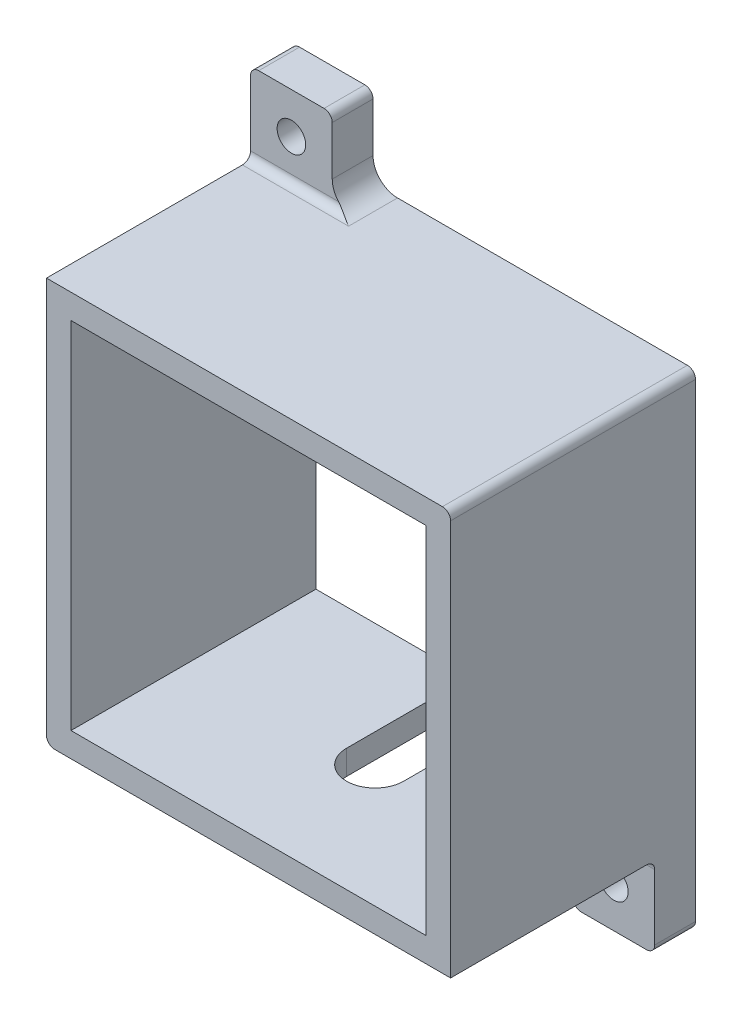
ISO-10303-21;
HEADER;
FILE_DESCRIPTION(('STEP AP214'),'2;1');
FILE_NAME('part.step','',(''),(''),'','','');
FILE_SCHEMA(('AUTOMOTIVE_DESIGN { 1 0 10303 214 1 1 1 1 }'));
ENDSEC;
DATA;
#1=APPLICATION_CONTEXT('core data for automotive mechanical design processes');
#2=APPLICATION_PROTOCOL_DEFINITION('international standard','automotive_design',2000,#1);
#3=PRODUCT_CONTEXT('',#1,'mechanical');
#4=PRODUCT('Part','Part','',(#3));
#5=PRODUCT_RELATED_PRODUCT_CATEGORY('part','',(#4));
#6=PRODUCT_DEFINITION_FORMATION('','',#4);
#7=PRODUCT_DEFINITION_CONTEXT('part definition',#1,'design');
#8=PRODUCT_DEFINITION('design','',#6,#7);
#9=PRODUCT_DEFINITION_SHAPE('','',#8);
#10=(LENGTH_UNIT() NAMED_UNIT(*) SI_UNIT(.MILLI.,.METRE.));
#11=(NAMED_UNIT(*) PLANE_ANGLE_UNIT() SI_UNIT($,.RADIAN.));
#12=(NAMED_UNIT(*) SI_UNIT($,.STERADIAN.) SOLID_ANGLE_UNIT());
#13=UNCERTAINTY_MEASURE_WITH_UNIT(LENGTH_MEASURE(1.E-05),#10,'distance_accuracy_value','');
#14=(GEOMETRIC_REPRESENTATION_CONTEXT(3) GLOBAL_UNCERTAINTY_ASSIGNED_CONTEXT((#13)) GLOBAL_UNIT_ASSIGNED_CONTEXT((#10,
#11,#12)) REPRESENTATION_CONTEXT('',''));
#15=CARTESIAN_POINT('',(0.,0.,0.));
#16=DIRECTION('',(0.,0.,1.));
#17=DIRECTION('',(1.,0.,0.));
#18=AXIS2_PLACEMENT_3D('',#15,#16,#17);
#19=CARTESIAN_POINT('',(0.,0.,30.));
#20=DIRECTION('',(0.,1.,0.));
#21=DIRECTION('',(0.,0.,1.));
#22=AXIS2_PLACEMENT_3D('',#19,#20,#21);
#23=PLANE('',#22);
#24=DIRECTION('',(1.,0.,0.));
#25=VECTOR('',#24,1.);
#26=CARTESIAN_POINT('',(0.,0.,0.));
#27=LINE('',#26,#25);
#28=CARTESIAN_POINT('',(1.,0.,0.));
#29=VERTEX_POINT('',#28);
#30=CARTESIAN_POINT('',(21.75,0.,0.));
#31=VERTEX_POINT('',#30);
#32=EDGE_CURVE('E258',#29,#31,#27,.T.);
#33=ORIENTED_EDGE('',*,*,#32,.T.);
#34=DIRECTION('',(0.,0.,1.));
#35=VECTOR('',#34,1.);
#36=CARTESIAN_POINT('',(21.75,0.,30.));
#37=LINE('',#36,#35);
#38=CARTESIAN_POINT('',(21.75,0.,15.));
#39=VERTEX_POINT('',#38);
#40=EDGE_CURVE('E248',#31,#39,#37,.T.);
#41=ORIENTED_EDGE('',*,*,#40,.T.);
#42=CARTESIAN_POINT('',(25.25,0.,15.));
#43=DIRECTION('',(0.,1.,0.));
#44=DIRECTION('',(0.,0.,1.));
#45=AXIS2_PLACEMENT_3D('',#42,#43,#44);
#46=CIRCLE('',#45,3.5);
#47=CARTESIAN_POINT('',(28.75,0.,15.));
#48=VERTEX_POINT('',#47);
#49=EDGE_CURVE('E246',#48,#39,#46,.F.);
#50=ORIENTED_EDGE('',*,*,#49,.F.);
#51=DIRECTION('',(0.,0.,1.));
#52=VECTOR('',#51,1.);
#53=CARTESIAN_POINT('',(28.75,0.,30.));
#54=LINE('',#53,#52);
#55=CARTESIAN_POINT('',(28.75,0.,0.));
#56=VERTEX_POINT('',#55);
#57=EDGE_CURVE('E231',#56,#48,#54,.T.);
#58=ORIENTED_EDGE('',*,*,#57,.F.);
#59=CARTESIAN_POINT('',(36.5,0.,0.));
#60=VERTEX_POINT('',#59);
#61=EDGE_CURVE('E243',#56,#60,#27,.T.);
#62=ORIENTED_EDGE('',*,*,#61,.T.);
#63=DIRECTION('',(0.,0.,-1.));
#64=VECTOR('',#63,1.);
#65=CARTESIAN_POINT('',(36.5,0.,30.));
#66=LINE('',#65,#64);
#67=CARTESIAN_POINT('',(36.5,0.,6.));
#68=VERTEX_POINT('',#67);
#69=EDGE_CURVE('E370',#60,#68,#66,.F.);
#70=ORIENTED_EDGE('',*,*,#69,.T.);
#71=DIRECTION('',(1.,0.,0.));
#72=VECTOR('',#71,1.);
#73=CARTESIAN_POINT('',(49.5,0.,6.));
#74=LINE('',#73,#72);
#75=CARTESIAN_POINT('',(49.5,0.,6.));
#76=VERTEX_POINT('',#75);
#77=EDGE_CURVE('E391',#68,#76,#74,.T.);
#78=ORIENTED_EDGE('',*,*,#77,.T.);
#79=DIRECTION('',(0.,0.,-1.));
#80=VECTOR('',#79,1.);
#81=CARTESIAN_POINT('',(49.5,0.,30.));
#82=LINE('',#81,#80);
#83=CARTESIAN_POINT('',(49.5,0.,30.));
#84=VERTEX_POINT('',#83);
#85=EDGE_CURVE('E281',#84,#76,#82,.T.);
#86=ORIENTED_EDGE('',*,*,#85,.F.);
#87=DIRECTION('',(1.,0.,0.));
#88=VECTOR('',#87,1.);
#89=CARTESIAN_POINT('',(0.,0.,30.));
#90=LINE('',#89,#88);
#91=CARTESIAN_POINT('',(1.,0.,30.));
#92=VERTEX_POINT('',#91);
#93=EDGE_CURVE('E558',#92,#84,#90,.T.);
#94=ORIENTED_EDGE('',*,*,#93,.F.);
#95=DIRECTION('',(0.,0.,-1.));
#96=VECTOR('',#95,1.);
#97=CARTESIAN_POINT('',(1.,0.,30.));
#98=LINE('',#97,#96);
#99=EDGE_CURVE('E328',#92,#29,#98,.T.);
#100=ORIENTED_EDGE('',*,*,#99,.T.);
#101=EDGE_LOOP('',(#33,#41,#50,#58,#62,#70,#78,#86,#94,#100));
#102=FACE_BOUND('',#101,.T.);
#103=ADVANCED_FACE('F43',(#102),#23,.F.);
#104=CARTESIAN_POINT('',(0.,49.5,30.));
#105=DIRECTION('',(0.,-1.,0.));
#106=DIRECTION('',(0.,0.,-1.));
#107=AXIS2_PLACEMENT_3D('',#104,#105,#106);
#108=PLANE('',#107);
#109=DIRECTION('',(0.,0.,-1.));
#110=VECTOR('',#109,1.);
#111=CARTESIAN_POINT('',(13.,49.5,30.));
#112=LINE('',#111,#110);
#113=CARTESIAN_POINT('',(13.,49.5,0.));
#114=VERTEX_POINT('',#113);
#115=CARTESIAN_POINT('',(13.,49.5,6.));
#116=VERTEX_POINT('',#115);
#117=EDGE_CURVE('E377',#114,#116,#112,.F.);
#118=ORIENTED_EDGE('',*,*,#117,.T.);
#119=DIRECTION('',(-1.,0.,0.));
#120=VECTOR('',#119,1.);
#121=CARTESIAN_POINT('',(0.,49.5,6.));
#122=LINE('',#121,#120);
#123=CARTESIAN_POINT('',(0.,49.5,6.));
#124=VERTEX_POINT('',#123);
#125=EDGE_CURVE('E398',#116,#124,#122,.T.);
#126=ORIENTED_EDGE('',*,*,#125,.T.);
#127=DIRECTION('',(0.,0.,-1.));
#128=VECTOR('',#127,1.);
#129=CARTESIAN_POINT('',(0.,49.5,30.));
#130=LINE('',#129,#128);
#131=CARTESIAN_POINT('',(0.,49.5,30.));
#132=VERTEX_POINT('',#131);
#133=EDGE_CURVE('E277',#132,#124,#130,.T.);
#134=ORIENTED_EDGE('',*,*,#133,.F.);
#135=DIRECTION('',(-1.,0.,0.));
#136=VECTOR('',#135,1.);
#137=CARTESIAN_POINT('',(0.,49.5,30.));
#138=LINE('',#137,#136);
#139=CARTESIAN_POINT('',(48.5,49.5,30.));
#140=VERTEX_POINT('',#139);
#141=EDGE_CURVE('E282',#140,#132,#138,.T.);
#142=ORIENTED_EDGE('',*,*,#141,.F.);
#143=DIRECTION('',(0.,0.,-1.));
#144=VECTOR('',#143,1.);
#145=CARTESIAN_POINT('',(48.5,49.5,30.));
#146=LINE('',#145,#144);
#147=CARTESIAN_POINT('',(48.5,49.5,0.));
#148=VERTEX_POINT('',#147);
#149=EDGE_CURVE('E345',#140,#148,#146,.T.);
#150=ORIENTED_EDGE('',*,*,#149,.T.);
#151=DIRECTION('',(-1.,0.,0.));
#152=VECTOR('',#151,1.);
#153=CARTESIAN_POINT('',(0.,49.5,0.));
#154=LINE('',#153,#152);
#155=EDGE_CURVE('E272',#148,#114,#154,.T.);
#156=ORIENTED_EDGE('',*,*,#155,.T.);
#157=EDGE_LOOP('',(#118,#126,#134,#142,#150,#156));
#158=FACE_BOUND('',#157,.T.);
#159=ADVANCED_FACE('F575',(#158),#108,.F.);
#160=CARTESIAN_POINT('',(0.,0.,30.));
#161=DIRECTION('',(0.,0.,-1.));
#162=DIRECTION('',(-1.,0.,0.));
#163=AXIS2_PLACEMENT_3D('',#160,#161,#162);
#164=PLANE('',#163);
#165=DIRECTION('',(0.,-1.,0.));
#166=VECTOR('',#165,1.);
#167=CARTESIAN_POINT('',(0.,0.,30.));
#168=LINE('',#167,#166);
#169=CARTESIAN_POINT('',(0.,1.,30.));
#170=VERTEX_POINT('',#169);
#171=EDGE_CURVE('E276',#132,#170,#168,.T.);
#172=ORIENTED_EDGE('',*,*,#171,.T.);
#173=CARTESIAN_POINT('',(1.,1.,30.));
#174=DIRECTION('',(0.,0.,-1.));
#175=DIRECTION('',(-1.,0.,0.));
#176=AXIS2_PLACEMENT_3D('',#173,#174,#175);
#177=CIRCLE('',#176,1.);
#178=EDGE_CURVE('E342',#170,#92,#177,.F.);
#179=ORIENTED_EDGE('',*,*,#178,.T.);
#180=ORIENTED_EDGE('',*,*,#93,.T.);
#181=DIRECTION('',(0.,1.,0.));
#182=VECTOR('',#181,1.);
#183=CARTESIAN_POINT('',(49.5,0.,30.));
#184=LINE('',#183,#182);
#185=CARTESIAN_POINT('',(49.5,48.5,30.));
#186=VERTEX_POINT('',#185);
#187=EDGE_CURVE('E561',#84,#186,#184,.T.);
#188=ORIENTED_EDGE('',*,*,#187,.T.);
#189=CARTESIAN_POINT('',(48.5,48.5,30.));
#190=DIRECTION('',(0.,0.,-1.));
#191=DIRECTION('',(-1.,0.,0.));
#192=AXIS2_PLACEMENT_3D('',#189,#190,#191);
#193=CIRCLE('',#192,1.);
#194=EDGE_CURVE('E339',#186,#140,#193,.F.);
#195=ORIENTED_EDGE('',*,*,#194,.T.);
#196=ORIENTED_EDGE('',*,*,#141,.T.);
#197=EDGE_LOOP('',(#172,#179,#180,#188,#195,#196));
#198=FACE_BOUND('',#197,.T.);
#199=DIRECTION('',(0.,-1.,0.));
#200=VECTOR('',#199,1.);
#201=CARTESIAN_POINT('',(3.,3.,30.));
#202=LINE('',#201,#200);
#203=CARTESIAN_POINT('',(3.,46.5,30.));
#204=VERTEX_POINT('',#203);
#205=CARTESIAN_POINT('',(3.,3.,30.));
#206=VERTEX_POINT('',#205);
#207=EDGE_CURVE('E513',#204,#206,#202,.T.);
#208=ORIENTED_EDGE('',*,*,#207,.F.);
#209=DIRECTION('',(-1.,0.,0.));
#210=VECTOR('',#209,1.);
#211=CARTESIAN_POINT('',(3.,46.5,30.));
#212=LINE('',#211,#210);
#213=CARTESIAN_POINT('',(46.5,46.5,30.));
#214=VERTEX_POINT('',#213);
#215=EDGE_CURVE('E524',#214,#204,#212,.T.);
#216=ORIENTED_EDGE('',*,*,#215,.F.);
#217=DIRECTION('',(0.,1.,0.));
#218=VECTOR('',#217,1.);
#219=CARTESIAN_POINT('',(46.5,3.,30.));
#220=LINE('',#219,#218);
#221=CARTESIAN_POINT('',(46.5,3.,30.));
#222=VERTEX_POINT('',#221);
#223=EDGE_CURVE('E520',#222,#214,#220,.T.);
#224=ORIENTED_EDGE('',*,*,#223,.F.);
#225=DIRECTION('',(1.,0.,0.));
#226=VECTOR('',#225,1.);
#227=CARTESIAN_POINT('',(3.,3.,30.));
#228=LINE('',#227,#226);
#229=EDGE_CURVE('E516',#206,#222,#228,.T.);
#230=ORIENTED_EDGE('',*,*,#229,.F.);
#231=EDGE_LOOP('',(#208,#216,#224,#230));
#232=FACE_BOUND('',#231,.T.);
#233=ADVANCED_FACE('F568',(#198,#232),#164,.F.);
#234=CARTESIAN_POINT('',(0.,0.,0.));
#235=DIRECTION('',(0.,0.,-1.));
#236=DIRECTION('',(-1.,0.,0.));
#237=AXIS2_PLACEMENT_3D('',#234,#235,#236);
#238=PLANE('',#237);
#239=DIRECTION('',(0.,1.,0.));
#240=VECTOR('',#239,1.);
#241=CARTESIAN_POINT('',(21.75,-24.,0.));
#242=LINE('',#241,#240);
#243=CARTESIAN_POINT('',(21.75,3.,0.));
#244=VERTEX_POINT('',#243);
#245=EDGE_CURVE('E238',#31,#244,#242,.T.);
#246=ORIENTED_EDGE('',*,*,#245,.F.);
#247=ORIENTED_EDGE('',*,*,#32,.F.);
#248=CARTESIAN_POINT('',(1.,1.,0.));
#249=DIRECTION('',(0.,0.,-1.));
#250=DIRECTION('',(-1.,0.,0.));
#251=AXIS2_PLACEMENT_3D('',#248,#249,#250);
#252=CIRCLE('',#251,1.);
#253=CARTESIAN_POINT('',(0.,1.,0.));
#254=VERTEX_POINT('',#253);
#255=EDGE_CURVE('E302',#29,#254,#252,.T.);
#256=ORIENTED_EDGE('',*,*,#255,.T.);
#257=DIRECTION('',(0.,-1.,0.));
#258=VECTOR('',#257,1.);
#259=CARTESIAN_POINT('',(0.,0.,0.));
#260=LINE('',#259,#258);
#261=CARTESIAN_POINT('',(0.,58.5,0.));
#262=VERTEX_POINT('',#261);
#263=EDGE_CURVE('E259',#262,#254,#260,.T.);
#264=ORIENTED_EDGE('',*,*,#263,.F.);
#265=CARTESIAN_POINT('',(1.,58.5,0.));
#266=DIRECTION('',(0.,0.,-1.));
#267=DIRECTION('',(-1.,0.,0.));
#268=AXIS2_PLACEMENT_3D('',#265,#266,#267);
#269=CIRCLE('',#268,1.);
#270=CARTESIAN_POINT('',(1.,59.5,0.));
#271=VERTEX_POINT('',#270);
#272=EDGE_CURVE('E293',#262,#271,#269,.T.);
#273=ORIENTED_EDGE('',*,*,#272,.T.);
#274=DIRECTION('',(1.,0.,0.));
#275=VECTOR('',#274,1.);
#276=CARTESIAN_POINT('',(0.,59.5,0.));
#277=LINE('',#276,#275);
#278=CARTESIAN_POINT('',(9.,59.5,0.));
#279=VERTEX_POINT('',#278);
#280=EDGE_CURVE('E490',#271,#279,#277,.T.);
#281=ORIENTED_EDGE('',*,*,#280,.T.);
#282=CARTESIAN_POINT('',(9.,58.5,0.));
#283=DIRECTION('',(0.,0.,-1.));
#284=DIRECTION('',(-1.,0.,0.));
#285=AXIS2_PLACEMENT_3D('',#282,#283,#284);
#286=CIRCLE('',#285,1.);
#287=CARTESIAN_POINT('',(10.,58.5,0.));
#288=VERTEX_POINT('',#287);
#289=EDGE_CURVE('E296',#279,#288,#286,.T.);
#290=ORIENTED_EDGE('',*,*,#289,.T.);
#291=DIRECTION('',(0.,-1.,0.));
#292=VECTOR('',#291,1.);
#293=CARTESIAN_POINT('',(10.,49.5,0.));
#294=LINE('',#293,#292);
#295=CARTESIAN_POINT('',(10.,52.5,0.));
#296=VERTEX_POINT('',#295);
#297=EDGE_CURVE('E498',#288,#296,#294,.T.);
#298=ORIENTED_EDGE('',*,*,#297,.T.);
#299=CARTESIAN_POINT('',(13.,52.5,0.));
#300=DIRECTION('',(0.,0.,-1.));
#301=DIRECTION('',(-1.,0.,0.));
#302=AXIS2_PLACEMENT_3D('',#299,#300,#301);
#303=CIRCLE('',#302,3.);
#304=EDGE_CURVE('E385',#296,#114,#303,.F.);
#305=ORIENTED_EDGE('',*,*,#304,.T.);
#306=ORIENTED_EDGE('',*,*,#155,.F.);
#307=CARTESIAN_POINT('',(48.5,48.5,0.));
#308=DIRECTION('',(0.,0.,-1.));
#309=DIRECTION('',(-1.,0.,0.));
#310=AXIS2_PLACEMENT_3D('',#307,#308,#309);
#311=CIRCLE('',#310,1.);
#312=CARTESIAN_POINT('',(49.5,48.5,0.));
#313=VERTEX_POINT('',#312);
#314=EDGE_CURVE('E299',#148,#313,#311,.T.);
#315=ORIENTED_EDGE('',*,*,#314,.T.);
#316=DIRECTION('',(0.,1.,0.));
#317=VECTOR('',#316,1.);
#318=CARTESIAN_POINT('',(49.5,0.,0.));
#319=LINE('',#318,#317);
#320=CARTESIAN_POINT('',(49.5,-9.,0.));
#321=VERTEX_POINT('',#320);
#322=EDGE_CURVE('E263',#321,#313,#319,.T.);
#323=ORIENTED_EDGE('',*,*,#322,.F.);
#324=CARTESIAN_POINT('',(48.5,-9.,0.));
#325=DIRECTION('',(0.,0.,-1.));
#326=DIRECTION('',(-1.,0.,0.));
#327=AXIS2_PLACEMENT_3D('',#324,#325,#326);
#328=CIRCLE('',#327,1.);
#329=CARTESIAN_POINT('',(48.5,-10.,0.));
#330=VERTEX_POINT('',#329);
#331=EDGE_CURVE('E308',#321,#330,#328,.T.);
#332=ORIENTED_EDGE('',*,*,#331,.T.);
#333=DIRECTION('',(-1.,0.,0.));
#334=VECTOR('',#333,1.);
#335=CARTESIAN_POINT('',(49.5,-10.,0.));
#336=LINE('',#335,#334);
#337=CARTESIAN_POINT('',(40.5,-10.,0.));
#338=VERTEX_POINT('',#337);
#339=EDGE_CURVE('E464',#330,#338,#336,.T.);
#340=ORIENTED_EDGE('',*,*,#339,.T.);
#341=CARTESIAN_POINT('',(40.5,-9.,0.));
#342=DIRECTION('',(0.,0.,-1.));
#343=DIRECTION('',(-1.,0.,0.));
#344=AXIS2_PLACEMENT_3D('',#341,#342,#343);
#345=CIRCLE('',#344,1.);
#346=CARTESIAN_POINT('',(39.5,-9.,0.));
#347=VERTEX_POINT('',#346);
#348=EDGE_CURVE('E305',#338,#347,#345,.T.);
#349=ORIENTED_EDGE('',*,*,#348,.T.);
#350=DIRECTION('',(0.,1.,0.));
#351=VECTOR('',#350,1.);
#352=CARTESIAN_POINT('',(39.5,0.,0.));
#353=LINE('',#352,#351);
#354=CARTESIAN_POINT('',(39.5,-3.,0.));
#355=VERTEX_POINT('',#354);
#356=EDGE_CURVE('E472',#347,#355,#353,.T.);
#357=ORIENTED_EDGE('',*,*,#356,.T.);
#358=CARTESIAN_POINT('',(36.5,-3.,0.));
#359=DIRECTION('',(0.,0.,-1.));
#360=DIRECTION('',(-1.,0.,0.));
#361=AXIS2_PLACEMENT_3D('',#358,#359,#360);
#362=CIRCLE('',#361,3.);
#363=EDGE_CURVE('E255',#355,#60,#362,.F.);
#364=ORIENTED_EDGE('',*,*,#363,.T.);
#365=ORIENTED_EDGE('',*,*,#61,.F.);
#366=DIRECTION('',(0.,1.,0.));
#367=VECTOR('',#366,1.);
#368=CARTESIAN_POINT('',(28.75,-24.,0.));
#369=LINE('',#368,#367);
#370=CARTESIAN_POINT('',(28.75,3.,0.));
#371=VERTEX_POINT('',#370);
#372=EDGE_CURVE('E228',#56,#371,#369,.T.);
#373=ORIENTED_EDGE('',*,*,#372,.T.);
#374=DIRECTION('',(1.,0.,0.));
#375=VECTOR('',#374,1.);
#376=CARTESIAN_POINT('',(3.,3.,0.));
#377=LINE('',#376,#375);
#378=CARTESIAN_POINT('',(46.5,3.,0.));
#379=VERTEX_POINT('',#378);
#380=EDGE_CURVE('E531',#371,#379,#377,.T.);
#381=ORIENTED_EDGE('',*,*,#380,.T.);
#382=DIRECTION('',(0.,1.,0.));
#383=VECTOR('',#382,1.);
#384=CARTESIAN_POINT('',(46.5,3.,0.));
#385=LINE('',#384,#383);
#386=CARTESIAN_POINT('',(46.5,46.5,0.));
#387=VERTEX_POINT('',#386);
#388=EDGE_CURVE('E535',#379,#387,#385,.T.);
#389=ORIENTED_EDGE('',*,*,#388,.T.);
#390=DIRECTION('',(-1.,0.,0.));
#391=VECTOR('',#390,1.);
#392=CARTESIAN_POINT('',(3.,46.5,0.));
#393=LINE('',#392,#391);
#394=CARTESIAN_POINT('',(3.,46.5,0.));
#395=VERTEX_POINT('',#394);
#396=EDGE_CURVE('E517',#387,#395,#393,.T.);
#397=ORIENTED_EDGE('',*,*,#396,.T.);
#398=DIRECTION('',(0.,-1.,0.));
#399=VECTOR('',#398,1.);
#400=CARTESIAN_POINT('',(3.,3.,0.));
#401=LINE('',#400,#399);
#402=CARTESIAN_POINT('',(3.,3.,0.));
#403=VERTEX_POINT('',#402);
#404=EDGE_CURVE('E506',#395,#403,#401,.T.);
#405=ORIENTED_EDGE('',*,*,#404,.T.);
#406=EDGE_CURVE('E532',#403,#244,#377,.T.);
#407=ORIENTED_EDGE('',*,*,#406,.T.);
#408=EDGE_LOOP('',(#246,#247,#256,#264,#273,#281,#290,#298,#305,#306,#315,#323,#332,#340,#349,
#357,#364,#365,#373,#381,#389,#397,#405,#407));
#409=FACE_BOUND('',#408,.T.);
#410=CARTESIAN_POINT('',(5.,54.5,0.));
#411=DIRECTION('',(0.,0.,-1.));
#412=DIRECTION('',(-1.,0.,0.));
#413=AXIS2_PLACEMENT_3D('',#410,#411,#412);
#414=CIRCLE('',#413,1.75);
#415=CARTESIAN_POINT('',(3.25,54.5,0.));
#416=VERTEX_POINT('',#415);
#417=EDGE_CURVE('E480',#416,#416,#414,.T.);
#418=ORIENTED_EDGE('',*,*,#417,.F.);
#419=EDGE_LOOP('',(#418));
#420=FACE_BOUND('',#419,.T.);
#421=CARTESIAN_POINT('',(44.5,-5.,0.));
#422=DIRECTION('',(0.,0.,-1.));
#423=DIRECTION('',(-1.,0.,0.));
#424=AXIS2_PLACEMENT_3D('',#421,#422,#423);
#425=CIRCLE('',#424,1.75);
#426=CARTESIAN_POINT('',(42.75,-5.,0.));
#427=VERTEX_POINT('',#426);
#428=EDGE_CURVE('E459',#427,#427,#425,.T.);
#429=ORIENTED_EDGE('',*,*,#428,.F.);
#430=EDGE_LOOP('',(#429));
#431=FACE_BOUND('',#430,.T.);
#432=ADVANCED_FACE('F252',(#409,#420,#431),#238,.T.);
#433=CARTESIAN_POINT('',(0.,0.,30.));
#434=DIRECTION('',(1.,0.,0.));
#435=DIRECTION('',(0.,0.,-1.));
#436=AXIS2_PLACEMENT_3D('',#433,#434,#435);
#437=PLANE('',#436);
#438=ORIENTED_EDGE('',*,*,#263,.T.);
#439=DIRECTION('',(0.,0.,-1.));
#440=VECTOR('',#439,1.);
#441=CARTESIAN_POINT('',(0.,1.,30.));
#442=LINE('',#441,#440);
#443=EDGE_CURVE('E336',#254,#170,#442,.F.);
#444=ORIENTED_EDGE('',*,*,#443,.T.);
#445=ORIENTED_EDGE('',*,*,#171,.F.);
#446=ORIENTED_EDGE('',*,*,#133,.T.);
#447=CARTESIAN_POINT('',(0.,50.5,6.));
#448=DIRECTION('',(1.,0.,0.));
#449=DIRECTION('',(0.,0.,-1.));
#450=AXIS2_PLACEMENT_3D('',#447,#448,#449);
#451=CIRCLE('',#450,1.);
#452=CARTESIAN_POINT('',(0.,50.5,5.));
#453=VERTEX_POINT('',#452);
#454=EDGE_CURVE('E416',#124,#453,#451,.T.);
#455=ORIENTED_EDGE('',*,*,#454,.T.);
#456=DIRECTION('',(0.,1.,0.));
#457=VECTOR('',#456,1.);
#458=CARTESIAN_POINT('',(0.,49.5,5.));
#459=LINE('',#458,#457);
#460=CARTESIAN_POINT('',(0.,58.5,5.));
#461=VERTEX_POINT('',#460);
#462=EDGE_CURVE('E494',#453,#461,#459,.T.);
#463=ORIENTED_EDGE('',*,*,#462,.T.);
#464=DIRECTION('',(0.,0.,-1.));
#465=VECTOR('',#464,1.);
#466=CARTESIAN_POINT('',(0.,58.5,0.));
#467=LINE('',#466,#465);
#468=EDGE_CURVE('E332',#461,#262,#467,.T.);
#469=ORIENTED_EDGE('',*,*,#468,.T.);
#470=EDGE_LOOP('',(#438,#444,#445,#446,#455,#463,#469));
#471=FACE_BOUND('',#470,.T.);
#472=ADVANCED_FACE('F578',(#471),#437,.F.);
#473=CARTESIAN_POINT('',(49.5,0.,30.));
#474=DIRECTION('',(-1.,0.,0.));
#475=DIRECTION('',(0.,0.,1.));
#476=AXIS2_PLACEMENT_3D('',#473,#474,#475);
#477=PLANE('',#476);
#478=ORIENTED_EDGE('',*,*,#85,.T.);
#479=CARTESIAN_POINT('',(49.5,-1.,6.));
#480=DIRECTION('',(-1.,0.,0.));
#481=DIRECTION('',(0.,0.,1.));
#482=AXIS2_PLACEMENT_3D('',#479,#480,#481);
#483=CIRCLE('',#482,1.);
#484=CARTESIAN_POINT('',(49.5,-1.,5.));
#485=VERTEX_POINT('',#484);
#486=EDGE_CURVE('E404',#76,#485,#483,.T.);
#487=ORIENTED_EDGE('',*,*,#486,.T.);
#488=DIRECTION('',(0.,-1.,0.));
#489=VECTOR('',#488,1.);
#490=CARTESIAN_POINT('',(49.5,0.,5.));
#491=LINE('',#490,#489);
#492=CARTESIAN_POINT('',(49.5,-9.,5.));
#493=VERTEX_POINT('',#492);
#494=EDGE_CURVE('E468',#485,#493,#491,.T.);
#495=ORIENTED_EDGE('',*,*,#494,.T.);
#496=DIRECTION('',(0.,0.,-1.));
#497=VECTOR('',#496,1.);
#498=CARTESIAN_POINT('',(49.5,-9.,0.));
#499=LINE('',#498,#497);
#500=EDGE_CURVE('E289',#493,#321,#499,.T.);
#501=ORIENTED_EDGE('',*,*,#500,.T.);
#502=ORIENTED_EDGE('',*,*,#322,.T.);
#503=DIRECTION('',(0.,0.,-1.));
#504=VECTOR('',#503,1.);
#505=CARTESIAN_POINT('',(49.5,48.5,30.));
#506=LINE('',#505,#504);
#507=EDGE_CURVE('E286',#313,#186,#506,.F.);
#508=ORIENTED_EDGE('',*,*,#507,.T.);
#509=ORIENTED_EDGE('',*,*,#187,.F.);
#510=EDGE_LOOP('',(#478,#487,#495,#501,#502,#508,#509));
#511=FACE_BOUND('',#510,.T.);
#512=ADVANCED_FACE('F590',(#511),#477,.F.);
#513=CARTESIAN_POINT('',(3.,3.,30.));
#514=DIRECTION('',(1.,0.,0.));
#515=DIRECTION('',(0.,0.,-1.));
#516=AXIS2_PLACEMENT_3D('',#513,#514,#515);
#517=PLANE('',#516);
#518=ORIENTED_EDGE('',*,*,#404,.F.);
#519=DIRECTION('',(0.,0.,-1.));
#520=VECTOR('',#519,1.);
#521=CARTESIAN_POINT('',(3.,46.5,30.));
#522=LINE('',#521,#520);
#523=EDGE_CURVE('E527',#204,#395,#522,.T.);
#524=ORIENTED_EDGE('',*,*,#523,.F.);
#525=ORIENTED_EDGE('',*,*,#207,.T.);
#526=DIRECTION('',(0.,0.,-1.));
#527=VECTOR('',#526,1.);
#528=CARTESIAN_POINT('',(3.,3.,30.));
#529=LINE('',#528,#527);
#530=EDGE_CURVE('E265',#206,#403,#529,.T.);
#531=ORIENTED_EDGE('',*,*,#530,.T.);
#532=EDGE_LOOP('',(#518,#524,#525,#531));
#533=FACE_BOUND('',#532,.T.);
#534=ADVANCED_FACE('F708',(#533),#517,.T.);
#535=CARTESIAN_POINT('',(3.,3.,30.));
#536=DIRECTION('',(0.,1.,0.));
#537=DIRECTION('',(-1.,0.,0.));
#538=AXIS2_PLACEMENT_3D('',#535,#536,#537);
#539=PLANE('',#538);
#540=DIRECTION('',(0.,0.,1.));
#541=VECTOR('',#540,1.);
#542=CARTESIAN_POINT('',(21.75,3.,30.));
#543=LINE('',#542,#541);
#544=CARTESIAN_POINT('',(21.75,3.,15.));
#545=VERTEX_POINT('',#544);
#546=EDGE_CURVE('E11',#244,#545,#543,.T.);
#547=ORIENTED_EDGE('',*,*,#546,.F.);
#548=ORIENTED_EDGE('',*,*,#406,.F.);
#549=ORIENTED_EDGE('',*,*,#530,.F.);
#550=ORIENTED_EDGE('',*,*,#229,.T.);
#551=DIRECTION('',(0.,0.,-1.));
#552=VECTOR('',#551,1.);
#553=CARTESIAN_POINT('',(46.5,3.,30.));
#554=LINE('',#553,#552);
#555=EDGE_CURVE('E548',#222,#379,#554,.T.);
#556=ORIENTED_EDGE('',*,*,#555,.T.);
#557=ORIENTED_EDGE('',*,*,#380,.F.);
#558=DIRECTION('',(0.,0.,1.));
#559=VECTOR('',#558,1.);
#560=CARTESIAN_POINT('',(28.75,3.,30.));
#561=LINE('',#560,#559);
#562=CARTESIAN_POINT('',(28.75,3.,15.));
#563=VERTEX_POINT('',#562);
#564=EDGE_CURVE('E233',#371,#563,#561,.T.);
#565=ORIENTED_EDGE('',*,*,#564,.T.);
#566=CARTESIAN_POINT('',(25.25,3.,15.));
#567=DIRECTION('',(0.,1.,0.));
#568=DIRECTION('',(-1.,0.,0.));
#569=AXIS2_PLACEMENT_3D('',#566,#567,#568);
#570=CIRCLE('',#569,3.5);
#571=EDGE_CURVE('E53',#563,#545,#570,.F.);
#572=ORIENTED_EDGE('',*,*,#571,.T.);
#573=EDGE_LOOP('',(#547,#548,#549,#550,#556,#557,#565,#572));
#574=FACE_BOUND('',#573,.T.);
#575=ADVANCED_FACE('F443',(#574),#539,.T.);
#576=CARTESIAN_POINT('',(46.5,3.,30.));
#577=DIRECTION('',(-1.,0.,0.));
#578=DIRECTION('',(0.,0.,1.));
#579=AXIS2_PLACEMENT_3D('',#576,#577,#578);
#580=PLANE('',#579);
#581=ORIENTED_EDGE('',*,*,#388,.F.);
#582=ORIENTED_EDGE('',*,*,#555,.F.);
#583=ORIENTED_EDGE('',*,*,#223,.T.);
#584=DIRECTION('',(0.,0.,-1.));
#585=VECTOR('',#584,1.);
#586=CARTESIAN_POINT('',(46.5,46.5,30.));
#587=LINE('',#586,#585);
#588=EDGE_CURVE('E545',#214,#387,#587,.T.);
#589=ORIENTED_EDGE('',*,*,#588,.T.);
#590=EDGE_LOOP('',(#581,#582,#583,#589));
#591=FACE_BOUND('',#590,.T.);
#592=ADVANCED_FACE('F701',(#591),#580,.T.);
#593=CARTESIAN_POINT('',(3.,46.5,30.));
#594=DIRECTION('',(0.,-1.,0.));
#595=DIRECTION('',(0.,0.,-1.));
#596=AXIS2_PLACEMENT_3D('',#593,#594,#595);
#597=PLANE('',#596);
#598=ORIENTED_EDGE('',*,*,#396,.F.);
#599=ORIENTED_EDGE('',*,*,#588,.F.);
#600=ORIENTED_EDGE('',*,*,#215,.T.);
#601=ORIENTED_EDGE('',*,*,#523,.T.);
#602=EDGE_LOOP('',(#598,#599,#600,#601));
#603=FACE_BOUND('',#602,.T.);
#604=ADVANCED_FACE('F696',(#603),#597,.T.);
#605=CARTESIAN_POINT('',(10.,49.5,5.));
#606=DIRECTION('',(1.,0.,0.));
#607=DIRECTION('',(0.,0.,-1.));
#608=AXIS2_PLACEMENT_3D('',#605,#606,#607);
#609=PLANE('',#608);
#610=DIRECTION('',(0.,-1.,0.));
#611=VECTOR('',#610,1.);
#612=CARTESIAN_POINT('',(10.,49.5,5.));
#613=LINE('',#612,#611);
#614=CARTESIAN_POINT('',(10.,58.5,5.));
#615=VERTEX_POINT('',#614);
#616=CARTESIAN_POINT('',(10.,52.5,5.));
#617=VERTEX_POINT('',#616);
#618=EDGE_CURVE('E502',#615,#617,#613,.T.);
#619=ORIENTED_EDGE('',*,*,#618,.T.);
#620=DIRECTION('',(0.,0.,-1.));
#621=VECTOR('',#620,1.);
#622=CARTESIAN_POINT('',(10.,52.5,5.));
#623=LINE('',#622,#621);
#624=EDGE_CURVE('E373',#617,#296,#623,.T.);
#625=ORIENTED_EDGE('',*,*,#624,.T.);
#626=ORIENTED_EDGE('',*,*,#297,.F.);
#627=DIRECTION('',(0.,0.,-1.));
#628=VECTOR('',#627,1.);
#629=CARTESIAN_POINT('',(10.,58.5,5.));
#630=LINE('',#629,#628);
#631=EDGE_CURVE('E356',#288,#615,#630,.F.);
#632=ORIENTED_EDGE('',*,*,#631,.T.);
#633=EDGE_LOOP('',(#619,#625,#626,#632));
#634=FACE_BOUND('',#633,.T.);
#635=ADVANCED_FACE('F600',(#634),#609,.T.);
#636=CARTESIAN_POINT('',(0.,59.5,5.));
#637=DIRECTION('',(0.,1.,0.));
#638=DIRECTION('',(0.,0.,1.));
#639=AXIS2_PLACEMENT_3D('',#636,#637,#638);
#640=PLANE('',#639);
#641=DIRECTION('',(1.,0.,0.));
#642=VECTOR('',#641,1.);
#643=CARTESIAN_POINT('',(0.,59.5,5.));
#644=LINE('',#643,#642);
#645=CARTESIAN_POINT('',(1.,59.5,5.));
#646=VERTEX_POINT('',#645);
#647=CARTESIAN_POINT('',(9.,59.5,5.));
#648=VERTEX_POINT('',#647);
#649=EDGE_CURVE('E497',#646,#648,#644,.T.);
#650=ORIENTED_EDGE('',*,*,#649,.T.);
#651=DIRECTION('',(0.,0.,-1.));
#652=VECTOR('',#651,1.);
#653=CARTESIAN_POINT('',(9.,59.5,5.));
#654=LINE('',#653,#652);
#655=EDGE_CURVE('E352',#648,#279,#654,.T.);
#656=ORIENTED_EDGE('',*,*,#655,.T.);
#657=ORIENTED_EDGE('',*,*,#280,.F.);
#658=DIRECTION('',(0.,0.,-1.));
#659=VECTOR('',#658,1.);
#660=CARTESIAN_POINT('',(1.,59.5,5.));
#661=LINE('',#660,#659);
#662=EDGE_CURVE('E349',#271,#646,#661,.F.);
#663=ORIENTED_EDGE('',*,*,#662,.T.);
#664=EDGE_LOOP('',(#650,#656,#657,#663));
#665=FACE_BOUND('',#664,.T.);
#666=ADVANCED_FACE('F611',(#665),#640,.T.);
#667=CARTESIAN_POINT('',(0.,0.,5.));
#668=DIRECTION('',(0.,0.,-1.));
#669=DIRECTION('',(-1.,0.,0.));
#670=AXIS2_PLACEMENT_3D('',#667,#668,#669);
#671=PLANE('',#670);
#672=CARTESIAN_POINT('',(5.,54.5,5.));
#673=DIRECTION('',(0.,0.,-1.));
#674=DIRECTION('',(-1.,0.,0.));
#675=AXIS2_PLACEMENT_3D('',#672,#673,#674);
#676=CIRCLE('',#675,1.75);
#677=CARTESIAN_POINT('',(3.25,54.5,5.));
#678=VERTEX_POINT('',#677);
#679=EDGE_CURVE('E486',#678,#678,#676,.T.);
#680=ORIENTED_EDGE('',*,*,#679,.T.);
#681=EDGE_LOOP('',(#680));
#682=FACE_BOUND('',#681,.T.);
#683=ORIENTED_EDGE('',*,*,#462,.F.);
#684=DIRECTION('',(-1.,0.,0.));
#685=VECTOR('',#684,1.);
#686=CARTESIAN_POINT('',(13.,50.5,5.));
#687=LINE('',#686,#685);
#688=CARTESIAN_POINT('',(10.7639320225002,50.5,5.));
#689=VERTEX_POINT('',#688);
#690=EDGE_CURVE('E68',#453,#689,#687,.F.);
#691=ORIENTED_EDGE('',*,*,#690,.T.);
#692=CARTESIAN_POINT('',(13.,52.5,5.));
#693=DIRECTION('',(0.,0.,-1.));
#694=DIRECTION('',(-1.,0.,0.));
#695=AXIS2_PLACEMENT_3D('',#692,#693,#694);
#696=CIRCLE('',#695,3.);
#697=EDGE_CURVE('E388',#689,#617,#696,.T.);
#698=ORIENTED_EDGE('',*,*,#697,.T.);
#699=ORIENTED_EDGE('',*,*,#618,.F.);
#700=CARTESIAN_POINT('',(9.,58.5,5.));
#701=DIRECTION('',(0.,0.,-1.));
#702=DIRECTION('',(-1.,0.,0.));
#703=AXIS2_PLACEMENT_3D('',#700,#701,#702);
#704=CIRCLE('',#703,1.);
#705=EDGE_CURVE('E363',#615,#648,#704,.F.);
#706=ORIENTED_EDGE('',*,*,#705,.T.);
#707=ORIENTED_EDGE('',*,*,#649,.F.);
#708=CARTESIAN_POINT('',(1.,58.5,5.));
#709=DIRECTION('',(0.,0.,-1.));
#710=DIRECTION('',(-1.,0.,0.));
#711=AXIS2_PLACEMENT_3D('',#708,#709,#710);
#712=CIRCLE('',#711,1.);
#713=EDGE_CURVE('E359',#646,#461,#712,.F.);
#714=ORIENTED_EDGE('',*,*,#713,.T.);
#715=EDGE_LOOP('',(#683,#691,#698,#699,#706,#707,#714));
#716=FACE_BOUND('',#715,.T.);
#717=ADVANCED_FACE('F604',(#682,#716),#671,.F.);
#718=CARTESIAN_POINT('',(5.,54.5,5.));
#719=DIRECTION('',(0.,0.,-1.));
#720=DIRECTION('',(-1.,0.,0.));
#721=AXIS2_PLACEMENT_3D('',#718,#719,#720);
#722=CYLINDRICAL_SURFACE('',#721,1.75);
#723=ORIENTED_EDGE('',*,*,#679,.F.);
#724=EDGE_LOOP('',(#723));
#725=FACE_BOUND('',#724,.T.);
#726=ORIENTED_EDGE('',*,*,#417,.T.);
#727=EDGE_LOOP('',(#726));
#728=FACE_BOUND('',#727,.T.);
#729=ADVANCED_FACE('F679',(#725,#728),#722,.F.);
#730=CARTESIAN_POINT('',(39.5,0.,5.));
#731=DIRECTION('',(-1.,0.,0.));
#732=DIRECTION('',(0.,0.,1.));
#733=AXIS2_PLACEMENT_3D('',#730,#731,#732);
#734=PLANE('',#733);
#735=DIRECTION('',(0.,1.,0.));
#736=VECTOR('',#735,1.);
#737=CARTESIAN_POINT('',(39.5,0.,5.));
#738=LINE('',#737,#736);
#739=CARTESIAN_POINT('',(39.5,-9.,5.));
#740=VERTEX_POINT('',#739);
#741=CARTESIAN_POINT('',(39.5,-3.,5.));
#742=VERTEX_POINT('',#741);
#743=EDGE_CURVE('E476',#740,#742,#738,.T.);
#744=ORIENTED_EDGE('',*,*,#743,.T.);
#745=DIRECTION('',(0.,0.,-1.));
#746=VECTOR('',#745,1.);
#747=CARTESIAN_POINT('',(39.5,-3.,5.));
#748=LINE('',#747,#746);
#749=EDGE_CURVE('E366',#742,#355,#748,.T.);
#750=ORIENTED_EDGE('',*,*,#749,.T.);
#751=ORIENTED_EDGE('',*,*,#356,.F.);
#752=DIRECTION('',(0.,0.,-1.));
#753=VECTOR('',#752,1.);
#754=CARTESIAN_POINT('',(39.5,-9.,5.));
#755=LINE('',#754,#753);
#756=EDGE_CURVE('E325',#347,#740,#755,.F.);
#757=ORIENTED_EDGE('',*,*,#756,.T.);
#758=EDGE_LOOP('',(#744,#750,#751,#757));
#759=FACE_BOUND('',#758,.T.);
#760=ADVANCED_FACE('F677',(#759),#734,.T.);
#761=CARTESIAN_POINT('',(49.5,-10.,5.));
#762=DIRECTION('',(0.,-1.,0.));
#763=DIRECTION('',(0.,0.,-1.));
#764=AXIS2_PLACEMENT_3D('',#761,#762,#763);
#765=PLANE('',#764);
#766=ORIENTED_EDGE('',*,*,#339,.F.);
#767=DIRECTION('',(0.,0.,-1.));
#768=VECTOR('',#767,1.);
#769=CARTESIAN_POINT('',(48.5,-10.,5.));
#770=LINE('',#769,#768);
#771=CARTESIAN_POINT('',(48.5,-10.,5.));
#772=VERTEX_POINT('',#771);
#773=EDGE_CURVE('E315',#330,#772,#770,.F.);
#774=ORIENTED_EDGE('',*,*,#773,.T.);
#775=DIRECTION('',(-1.,0.,0.));
#776=VECTOR('',#775,1.);
#777=CARTESIAN_POINT('',(49.5,-10.,5.));
#778=LINE('',#777,#776);
#779=CARTESIAN_POINT('',(40.5,-10.,5.));
#780=VERTEX_POINT('',#779);
#781=EDGE_CURVE('E471',#772,#780,#778,.T.);
#782=ORIENTED_EDGE('',*,*,#781,.T.);
#783=DIRECTION('',(0.,0.,-1.));
#784=VECTOR('',#783,1.);
#785=CARTESIAN_POINT('',(40.5,-10.,5.));
#786=LINE('',#785,#784);
#787=EDGE_CURVE('E311',#780,#338,#786,.T.);
#788=ORIENTED_EDGE('',*,*,#787,.T.);
#789=EDGE_LOOP('',(#766,#774,#782,#788));
#790=FACE_BOUND('',#789,.T.);
#791=ADVANCED_FACE('F671',(#790),#765,.T.);
#792=CARTESIAN_POINT('',(0.,0.,5.));
#793=DIRECTION('',(0.,0.,-1.));
#794=DIRECTION('',(-1.,0.,0.));
#795=AXIS2_PLACEMENT_3D('',#792,#793,#794);
#796=PLANE('',#795);
#797=CARTESIAN_POINT('',(44.5,-5.,5.));
#798=DIRECTION('',(0.,0.,-1.));
#799=DIRECTION('',(-1.,0.,0.));
#800=AXIS2_PLACEMENT_3D('',#797,#798,#799);
#801=CIRCLE('',#800,1.75);
#802=CARTESIAN_POINT('',(42.75,-5.,5.));
#803=VERTEX_POINT('',#802);
#804=EDGE_CURVE('E460',#803,#803,#801,.T.);
#805=ORIENTED_EDGE('',*,*,#804,.T.);
#806=EDGE_LOOP('',(#805));
#807=FACE_BOUND('',#806,.T.);
#808=ORIENTED_EDGE('',*,*,#494,.F.);
#809=DIRECTION('',(1.,0.,0.));
#810=VECTOR('',#809,1.);
#811=CARTESIAN_POINT('',(36.5,-1.,5.));
#812=LINE('',#811,#810);
#813=CARTESIAN_POINT('',(38.7360679774998,-1.,5.));
#814=VERTEX_POINT('',#813);
#815=EDGE_CURVE('E395',#485,#814,#812,.F.);
#816=ORIENTED_EDGE('',*,*,#815,.T.);
#817=CARTESIAN_POINT('',(36.5,-3.,5.));
#818=DIRECTION('',(0.,0.,-1.));
#819=DIRECTION('',(-1.,0.,0.));
#820=AXIS2_PLACEMENT_3D('',#817,#818,#819);
#821=CIRCLE('',#820,3.);
#822=EDGE_CURVE('E382',#814,#742,#821,.T.);
#823=ORIENTED_EDGE('',*,*,#822,.T.);
#824=ORIENTED_EDGE('',*,*,#743,.F.);
#825=CARTESIAN_POINT('',(40.5,-9.,5.));
#826=DIRECTION('',(0.,0.,-1.));
#827=DIRECTION('',(-1.,0.,0.));
#828=AXIS2_PLACEMENT_3D('',#825,#826,#827);
#829=CIRCLE('',#828,1.);
#830=EDGE_CURVE('E318',#740,#780,#829,.F.);
#831=ORIENTED_EDGE('',*,*,#830,.T.);
#832=ORIENTED_EDGE('',*,*,#781,.F.);
#833=CARTESIAN_POINT('',(48.5,-9.,5.));
#834=DIRECTION('',(0.,0.,-1.));
#835=DIRECTION('',(-1.,0.,0.));
#836=AXIS2_PLACEMENT_3D('',#833,#834,#835);
#837=CIRCLE('',#836,1.);
#838=EDGE_CURVE('E321',#772,#493,#837,.F.);
#839=ORIENTED_EDGE('',*,*,#838,.T.);
#840=EDGE_LOOP('',(#808,#816,#823,#824,#831,#832,#839));
#841=FACE_BOUND('',#840,.T.);
#842=ADVANCED_FACE('F664',(#807,#841),#796,.F.);
#843=CARTESIAN_POINT('',(44.5,-5.,5.));
#844=DIRECTION('',(0.,0.,-1.));
#845=DIRECTION('',(-1.,0.,0.));
#846=AXIS2_PLACEMENT_3D('',#843,#844,#845);
#847=CYLINDRICAL_SURFACE('',#846,1.75);
#848=ORIENTED_EDGE('',*,*,#804,.F.);
#849=EDGE_LOOP('',(#848));
#850=FACE_BOUND('',#849,.T.);
#851=ORIENTED_EDGE('',*,*,#428,.T.);
#852=EDGE_LOOP('',(#851));
#853=FACE_BOUND('',#852,.T.);
#854=ADVANCED_FACE('F640',(#850,#853),#847,.F.);
#855=CARTESIAN_POINT('',(48.5,-9.,30.));
#856=DIRECTION('',(0.,0.,1.));
#857=DIRECTION('',(1.,0.,0.));
#858=AXIS2_PLACEMENT_3D('',#855,#856,#857);
#859=CYLINDRICAL_SURFACE('',#858,1.);
#860=ORIENTED_EDGE('',*,*,#838,.F.);
#861=ORIENTED_EDGE('',*,*,#773,.F.);
#862=ORIENTED_EDGE('',*,*,#331,.F.);
#863=ORIENTED_EDGE('',*,*,#500,.F.);
#864=EDGE_LOOP('',(#860,#861,#862,#863));
#865=FACE_BOUND('',#864,.T.);
#866=ADVANCED_FACE('F636',(#865),#859,.T.);
#867=CARTESIAN_POINT('',(40.5,-9.,5.));
#868=DIRECTION('',(0.,0.,-1.));
#869=DIRECTION('',(-1.,0.,0.));
#870=AXIS2_PLACEMENT_3D('',#867,#868,#869);
#871=CYLINDRICAL_SURFACE('',#870,1.);
#872=ORIENTED_EDGE('',*,*,#830,.F.);
#873=ORIENTED_EDGE('',*,*,#756,.F.);
#874=ORIENTED_EDGE('',*,*,#348,.F.);
#875=ORIENTED_EDGE('',*,*,#787,.F.);
#876=EDGE_LOOP('',(#872,#873,#874,#875));
#877=FACE_BOUND('',#876,.T.);
#878=ADVANCED_FACE('F639',(#877),#871,.T.);
#879=CARTESIAN_POINT('',(1.,1.,30.));
#880=DIRECTION('',(0.,0.,-1.));
#881=DIRECTION('',(-1.,0.,0.));
#882=AXIS2_PLACEMENT_3D('',#879,#880,#881);
#883=CYLINDRICAL_SURFACE('',#882,1.);
#884=ORIENTED_EDGE('',*,*,#178,.F.);
#885=ORIENTED_EDGE('',*,*,#443,.F.);
#886=ORIENTED_EDGE('',*,*,#255,.F.);
#887=ORIENTED_EDGE('',*,*,#99,.F.);
#888=EDGE_LOOP('',(#884,#885,#886,#887));
#889=FACE_BOUND('',#888,.T.);
#890=ADVANCED_FACE('F582',(#889),#883,.T.);
#891=CARTESIAN_POINT('',(48.5,48.5,30.));
#892=DIRECTION('',(0.,0.,-1.));
#893=DIRECTION('',(-1.,0.,0.));
#894=AXIS2_PLACEMENT_3D('',#891,#892,#893);
#895=CYLINDRICAL_SURFACE('',#894,1.);
#896=ORIENTED_EDGE('',*,*,#194,.F.);
#897=ORIENTED_EDGE('',*,*,#507,.F.);
#898=ORIENTED_EDGE('',*,*,#314,.F.);
#899=ORIENTED_EDGE('',*,*,#149,.F.);
#900=EDGE_LOOP('',(#896,#897,#898,#899));
#901=FACE_BOUND('',#900,.T.);
#902=ADVANCED_FACE('F593',(#901),#895,.T.);
#903=CARTESIAN_POINT('',(9.,58.5,5.));
#904=DIRECTION('',(0.,0.,-1.));
#905=DIRECTION('',(-1.,0.,0.));
#906=AXIS2_PLACEMENT_3D('',#903,#904,#905);
#907=CYLINDRICAL_SURFACE('',#906,1.);
#908=ORIENTED_EDGE('',*,*,#705,.F.);
#909=ORIENTED_EDGE('',*,*,#631,.F.);
#910=ORIENTED_EDGE('',*,*,#289,.F.);
#911=ORIENTED_EDGE('',*,*,#655,.F.);
#912=EDGE_LOOP('',(#908,#909,#910,#911));
#913=FACE_BOUND('',#912,.T.);
#914=ADVANCED_FACE('F608',(#913),#907,.T.);
#915=CARTESIAN_POINT('',(1.,58.5,30.));
#916=DIRECTION('',(0.,0.,1.));
#917=DIRECTION('',(1.,0.,0.));
#918=AXIS2_PLACEMENT_3D('',#915,#916,#917);
#919=CYLINDRICAL_SURFACE('',#918,1.);
#920=ORIENTED_EDGE('',*,*,#713,.F.);
#921=ORIENTED_EDGE('',*,*,#662,.F.);
#922=ORIENTED_EDGE('',*,*,#272,.F.);
#923=ORIENTED_EDGE('',*,*,#468,.F.);
#924=EDGE_LOOP('',(#920,#921,#922,#923));
#925=FACE_BOUND('',#924,.T.);
#926=ADVANCED_FACE('F616',(#925),#919,.T.);
#927=CARTESIAN_POINT('',(36.5,-3.,5.));
#928=DIRECTION('',(0.,0.,-1.));
#929=DIRECTION('',(-1.,0.,0.));
#930=AXIS2_PLACEMENT_3D('',#927,#928,#929);
#931=CYLINDRICAL_SURFACE('',#930,3.);
#932=ORIENTED_EDGE('',*,*,#822,.F.);
#933=CARTESIAN_POINT('',(38.7360679774998,-1.,5.));
#934=CARTESIAN_POINT('',(38.7077572937075,-0.96834212278272,5.00000455551072));
#935=CARTESIAN_POINT('',(38.6787885816354,-0.937312555622993,5.00150263052097));
#936=CARTESIAN_POINT('',(38.6197274162069,-0.876667827494276,5.00716698518481));
#937=CARTESIAN_POINT('',(38.5896364379924,-0.847050918864004,5.01132987097531));
#938=CARTESIAN_POINT('',(38.4983201473494,-0.76087372573372,5.02726423180946));
#939=CARTESIAN_POINT('',(38.435618835025,-0.706505152893303,5.0424913092058));
#940=CARTESIAN_POINT('',(38.2651445015374,-0.570438642770909,5.09243701781799));
#941=CARTESIAN_POINT('',(38.1548259454961,-0.49425536690275,5.13338882471226));
#942=CARTESIAN_POINT('',(37.9287723628818,-0.358762722076831,5.22818730591389));
#943=CARTESIAN_POINT('',(37.8130077259145,-0.299562085910925,5.28211317833401));
#944=CARTESIAN_POINT('',(37.6122851667142,-0.212331076053217,5.38145907332464));
#945=CARTESIAN_POINT('',(37.5280484674357,-0.180233319110978,5.42486125147372));
#946=CARTESIAN_POINT('',(37.3584871191474,-0.12406799785236,5.51466433611523));
#947=CARTESIAN_POINT('',(37.2731619436707,-0.100004485191333,5.56106674158028));
#948=CARTESIAN_POINT('',(37.016562041974,-0.0395970923530306,5.70303658057038));
#949=CARTESIAN_POINT('',(36.8440816395105,-0.014789766543805,5.80166601961614));
#950=CARTESIAN_POINT('',(36.6175431072321,-0.00181595370149067,5.93214230188715));
#951=CARTESIAN_POINT('',(36.5635187811277,-0.000185833717347073,5.96332773518389));
#952=CARTESIAN_POINT('',(36.5063245855027,-5.00190846784832E-06,5.99634849414387));
#953=CARTESIAN_POINT('',(36.5031623061903,-2.18032768572542E-09,5.99817423684659));
#954=CARTESIAN_POINT('',(36.5,0.,6.));
#955=B_SPLINE_CURVE_WITH_KNOTS('',3,(#933,#934,#935,#936,#937,#938,#939,#940,#941,#942,#943,
#944,#945,#946,#947,#948,#949,#950,#951,#952,#953,#954),.UNSPECIFIED.,.F.,.F.,(4,2,2,2,2,2,2,2,
2,2,4),(0.,0.127328124372183,0.254494407314579,0.506902758847988,0.925154347494153,
1.3460269287566,1.64578712718783,1.94569826663474,2.54344782717993,2.73062158792369,
2.74157604934411),.UNSPECIFIED.);
#956=EDGE_CURVE('E407',#814,#68,#955,.T.);
#957=ORIENTED_EDGE('',*,*,#956,.T.);
#958=ORIENTED_EDGE('',*,*,#69,.F.);
#959=ORIENTED_EDGE('',*,*,#363,.F.);
#960=ORIENTED_EDGE('',*,*,#749,.F.);
#961=EDGE_LOOP('',(#932,#957,#958,#959,#960));
#962=FACE_BOUND('',#961,.T.);
#963=ADVANCED_FACE('F418',(#962),#931,.F.);
#964=CARTESIAN_POINT('',(13.,52.5,5.));
#965=DIRECTION('',(0.,0.,-1.));
#966=DIRECTION('',(-1.,0.,0.));
#967=AXIS2_PLACEMENT_3D('',#964,#965,#966);
#968=CYLINDRICAL_SURFACE('',#967,3.);
#969=ORIENTED_EDGE('',*,*,#697,.F.);
#970=CARTESIAN_POINT('',(10.7639320225002,50.5,5.));
#971=CARTESIAN_POINT('',(10.7922427062925,50.4683421227827,5.00000455551072));
#972=CARTESIAN_POINT('',(10.8212114183646,50.437312555623,5.00150263052097));
#973=CARTESIAN_POINT('',(10.8802725837931,50.3766678274943,5.00716698518481));
#974=CARTESIAN_POINT('',(10.9103635620076,50.347050918864,5.0113298709753));
#975=CARTESIAN_POINT('',(11.0016798526505,50.2608737257337,5.02726423180945));
#976=CARTESIAN_POINT('',(11.064381164975,50.2065051528933,5.04249130920579));
#977=CARTESIAN_POINT('',(11.2348554984626,50.0704386427709,5.092437017818));
#978=CARTESIAN_POINT('',(11.3451740545039,49.9942553669027,5.13338882471228));
#979=CARTESIAN_POINT('',(11.5712276371182,49.8587627220768,5.2281873059139));
#980=CARTESIAN_POINT('',(11.6869922740856,49.7995620859109,5.28211317833401));
#981=CARTESIAN_POINT('',(11.8877148332858,49.7123310760532,5.38145907332466));
#982=CARTESIAN_POINT('',(11.9719515325643,49.680233319111,5.42486125147377));
#983=CARTESIAN_POINT('',(12.1415128808526,49.6240679978524,5.51466433611519));
#984=CARTESIAN_POINT('',(12.2268380563294,49.6000044851913,5.56106674158012));
#985=CARTESIAN_POINT('',(12.4834379580259,49.539597092353,5.7030365805707));
#986=CARTESIAN_POINT('',(12.6559183604885,49.5147897665438,5.80166601961787));
#987=CARTESIAN_POINT('',(12.8824568927682,49.5018159537015,5.93214230188661));
#988=CARTESIAN_POINT('',(12.9364812188731,49.5001858337173,5.9633277351825));
#989=CARTESIAN_POINT('',(12.9936754144974,49.5000050019085,5.99634849414372));
#990=CARTESIAN_POINT('',(12.9968376938098,49.5000000021803,5.9981742368465));
#991=CARTESIAN_POINT('',(13.,49.5,6.));
#992=B_SPLINE_CURVE_WITH_KNOTS('',3,(#970,#971,#972,#973,#974,#975,#976,#977,#978,#979,#980,
#981,#982,#983,#984,#985,#986,#987,#988,#989,#990,#991),.UNSPECIFIED.,.F.,.F.,(4,2,2,2,2,2,2,2,
2,2,4),(0.,0.127328124372167,0.254494407314543,0.506902758847991,0.925154347494209,
1.34602692875663,1.64578712718784,1.94569826663473,2.54344782717996,2.73062158792369,
2.74157604934411),.UNSPECIFIED.);
#993=EDGE_CURVE('E430',#689,#116,#992,.T.);
#994=ORIENTED_EDGE('',*,*,#993,.T.);
#995=ORIENTED_EDGE('',*,*,#117,.F.);
#996=ORIENTED_EDGE('',*,*,#304,.F.);
#997=ORIENTED_EDGE('',*,*,#624,.F.);
#998=EDGE_LOOP('',(#969,#994,#995,#996,#997));
#999=FACE_BOUND('',#998,.T.);
#1000=ADVANCED_FACE('F425',(#999),#968,.F.);
#1001=CARTESIAN_POINT('',(0.,-1.,6.));
#1002=DIRECTION('',(-1.,0.,0.));
#1003=DIRECTION('',(0.,0.,1.));
#1004=AXIS2_PLACEMENT_3D('',#1001,#1002,#1003);
#1005=CYLINDRICAL_SURFACE('',#1004,1.);
#1006=ORIENTED_EDGE('',*,*,#956,.F.);
#1007=ORIENTED_EDGE('',*,*,#815,.F.);
#1008=ORIENTED_EDGE('',*,*,#486,.F.);
#1009=ORIENTED_EDGE('',*,*,#77,.F.);
#1010=EDGE_LOOP('',(#1006,#1007,#1008,#1009));
#1011=FACE_BOUND('',#1010,.T.);
#1012=ADVANCED_FACE('F422',(#1011),#1005,.F.);
#1013=CARTESIAN_POINT('',(0.,50.5,6.));
#1014=DIRECTION('',(1.,0.,0.));
#1015=DIRECTION('',(0.,0.,-1.));
#1016=AXIS2_PLACEMENT_3D('',#1013,#1014,#1015);
#1017=CYLINDRICAL_SURFACE('',#1016,1.);
#1018=ORIENTED_EDGE('',*,*,#993,.F.);
#1019=ORIENTED_EDGE('',*,*,#690,.F.);
#1020=ORIENTED_EDGE('',*,*,#454,.F.);
#1021=ORIENTED_EDGE('',*,*,#125,.F.);
#1022=EDGE_LOOP('',(#1018,#1019,#1020,#1021));
#1023=FACE_BOUND('',#1022,.T.);
#1024=ADVANCED_FACE('F45',(#1023),#1017,.F.);
#1025=CARTESIAN_POINT('',(25.25,-24.,15.));
#1026=DIRECTION('',(0.,1.,0.));
#1027=DIRECTION('',(0.,0.,1.));
#1028=AXIS2_PLACEMENT_3D('',#1025,#1026,#1027);
#1029=CYLINDRICAL_SURFACE('',#1028,3.5);
#1030=ORIENTED_EDGE('',*,*,#49,.T.);
#1031=DIRECTION('',(0.,1.,0.));
#1032=VECTOR('',#1031,1.);
#1033=CARTESIAN_POINT('',(21.75,-24.,15.));
#1034=LINE('',#1033,#1032);
#1035=EDGE_CURVE('E249',#39,#545,#1034,.T.);
#1036=ORIENTED_EDGE('',*,*,#1035,.T.);
#1037=ORIENTED_EDGE('',*,*,#571,.F.);
#1038=DIRECTION('',(0.,1.,0.));
#1039=VECTOR('',#1038,1.);
#1040=CARTESIAN_POINT('',(28.75,-24.,15.));
#1041=LINE('',#1040,#1039);
#1042=EDGE_CURVE('E60',#48,#563,#1041,.T.);
#1043=ORIENTED_EDGE('',*,*,#1042,.F.);
#1044=EDGE_LOOP('',(#1030,#1036,#1037,#1043));
#1045=FACE_BOUND('',#1044,.T.);
#1046=ADVANCED_FACE('F447',(#1045),#1029,.F.);
#1047=CARTESIAN_POINT('',(21.75,-24.,0.));
#1048=DIRECTION('',(-1.,0.,0.));
#1049=DIRECTION('',(0.,0.,1.));
#1050=AXIS2_PLACEMENT_3D('',#1047,#1048,#1049);
#1051=PLANE('',#1050);
#1052=ORIENTED_EDGE('',*,*,#245,.T.);
#1053=ORIENTED_EDGE('',*,*,#546,.T.);
#1054=ORIENTED_EDGE('',*,*,#1035,.F.);
#1055=ORIENTED_EDGE('',*,*,#40,.F.);
#1056=EDGE_LOOP('',(#1052,#1053,#1054,#1055));
#1057=FACE_BOUND('',#1056,.T.);
#1058=ADVANCED_FACE('F624',(#1057),#1051,.F.);
#1059=CARTESIAN_POINT('',(28.75,-24.,0.));
#1060=DIRECTION('',(-1.,0.,0.));
#1061=DIRECTION('',(0.,0.,1.));
#1062=AXIS2_PLACEMENT_3D('',#1059,#1060,#1061);
#1063=PLANE('',#1062);
#1064=ORIENTED_EDGE('',*,*,#57,.T.);
#1065=ORIENTED_EDGE('',*,*,#1042,.T.);
#1066=ORIENTED_EDGE('',*,*,#564,.F.);
#1067=ORIENTED_EDGE('',*,*,#372,.F.);
#1068=EDGE_LOOP('',(#1064,#1065,#1066,#1067));
#1069=FACE_BOUND('',#1068,.T.);
#1070=ADVANCED_FACE('F230',(#1069),#1063,.T.);
#1071=CLOSED_SHELL('',(#103,#159,#233,#432,#472,#512,#534,#575,#592,#604,#635,#666,#717,#729,
#760,#791,#842,#854,#866,#878,#890,#902,#914,#926,#963,#1000,#1012,#1024,#1046,#1058,#1070));
#1072=MANIFOLD_SOLID_BREP('B2',#1071);
#1073=ADVANCED_BREP_SHAPE_REPRESENTATION('',(#18,#1072),#14);
#1074=SHAPE_DEFINITION_REPRESENTATION(#9,#1073);
ENDSEC;
END-ISO-10303-21;
